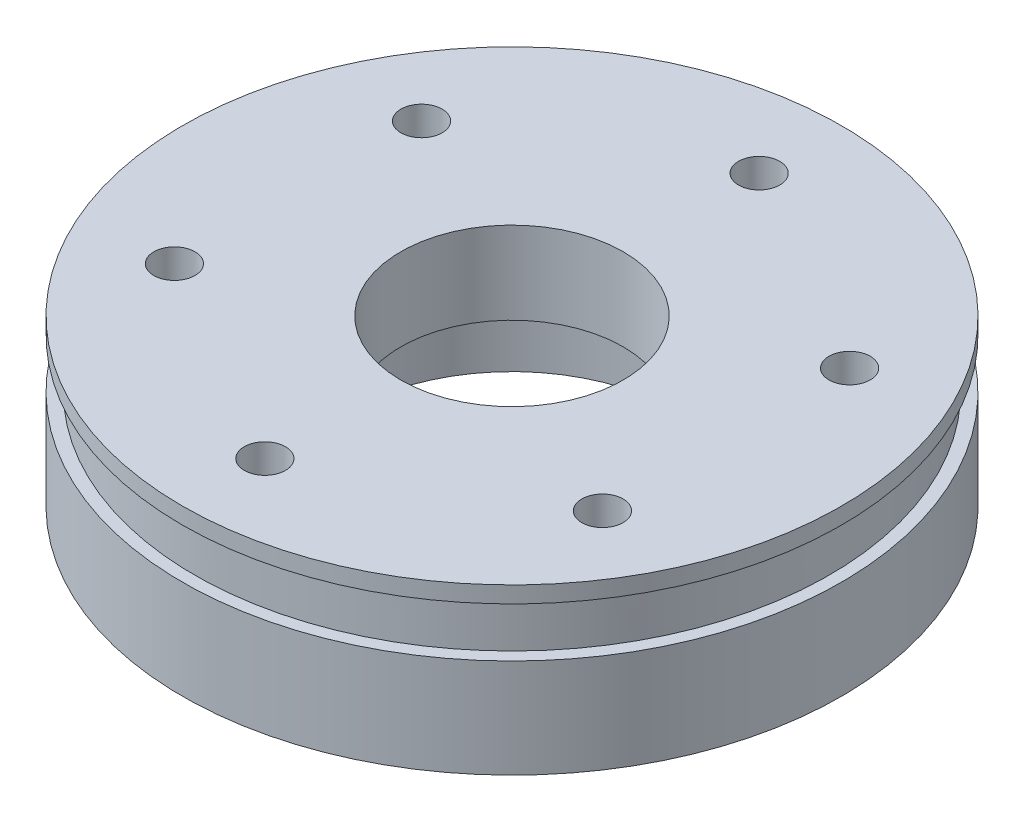
ISO-10303-21;
HEADER;
FILE_DESCRIPTION(('STEP AP214'),'2;1');
FILE_NAME('part.step','',(''),(''),'','','');
FILE_SCHEMA(('AUTOMOTIVE_DESIGN { 1 0 10303 214 1 1 1 1 }'));
ENDSEC;
DATA;
#1=APPLICATION_CONTEXT('core data for automotive mechanical design processes');
#2=APPLICATION_PROTOCOL_DEFINITION('international standard','automotive_design',2000,#1);
#3=PRODUCT_CONTEXT('',#1,'mechanical');
#4=PRODUCT('Part','Part','',(#3));
#5=PRODUCT_RELATED_PRODUCT_CATEGORY('part','',(#4));
#6=PRODUCT_DEFINITION_FORMATION('','',#4);
#7=PRODUCT_DEFINITION_CONTEXT('part definition',#1,'design');
#8=PRODUCT_DEFINITION('design','',#6,#7);
#9=PRODUCT_DEFINITION_SHAPE('','',#8);
#10=(LENGTH_UNIT() NAMED_UNIT(*) SI_UNIT(.MILLI.,.METRE.));
#11=(NAMED_UNIT(*) PLANE_ANGLE_UNIT() SI_UNIT($,.RADIAN.));
#12=(NAMED_UNIT(*) SI_UNIT($,.STERADIAN.) SOLID_ANGLE_UNIT());
#13=UNCERTAINTY_MEASURE_WITH_UNIT(LENGTH_MEASURE(1.E-05),#10,'distance_accuracy_value','');
#14=(GEOMETRIC_REPRESENTATION_CONTEXT(3) GLOBAL_UNCERTAINTY_ASSIGNED_CONTEXT((#13)) GLOBAL_UNIT_ASSIGNED_CONTEXT((#10,
#11,#12)) REPRESENTATION_CONTEXT('',''));
#15=CARTESIAN_POINT('',(0.,0.,0.));
#16=DIRECTION('',(0.,0.,1.));
#17=DIRECTION('',(1.,0.,0.));
#18=AXIS2_PLACEMENT_3D('',#15,#16,#17);
#19=CARTESIAN_POINT('',(0.,10.,0.));
#20=DIRECTION('',(0.,-1.,0.));
#21=DIRECTION('',(0.,0.,-1.));
#22=AXIS2_PLACEMENT_3D('',#19,#20,#21);
#23=CYLINDRICAL_SURFACE('',#22,13.5);
#24=CARTESIAN_POINT('',(0.,10.,0.));
#25=DIRECTION('',(0.,-1.,0.));
#26=DIRECTION('',(0.,0.,-1.));
#27=AXIS2_PLACEMENT_3D('',#24,#25,#26);
#28=CIRCLE('',#27,13.5);
#29=CARTESIAN_POINT('',(0.,10.,-13.5));
#30=VERTEX_POINT('',#29);
#31=EDGE_CURVE('E58',#30,#30,#28,.T.);
#32=ORIENTED_EDGE('',*,*,#31,.F.);
#33=EDGE_LOOP('',(#32));
#34=FACE_BOUND('',#33,.T.);
#35=CARTESIAN_POINT('',(0.,0.,0.));
#36=DIRECTION('',(0.,-1.,0.));
#37=DIRECTION('',(0.,0.,-1.));
#38=AXIS2_PLACEMENT_3D('',#35,#36,#37);
#39=CIRCLE('',#38,13.5);
#40=CARTESIAN_POINT('',(0.,0.,-13.5));
#41=VERTEX_POINT('',#40);
#42=EDGE_CURVE('E36',#41,#41,#39,.F.);
#43=ORIENTED_EDGE('',*,*,#42,.F.);
#44=EDGE_LOOP('',(#43));
#45=FACE_BOUND('',#44,.T.);
#46=ADVANCED_FACE('F32',(#34,#45),#23,.F.);
#47=CARTESIAN_POINT('',(0.,10.,0.));
#48=DIRECTION('',(0.,-1.,0.));
#49=DIRECTION('',(0.,0.,-1.));
#50=AXIS2_PLACEMENT_3D('',#47,#48,#49);
#51=CYLINDRICAL_SURFACE('',#50,38.515);
#52=CARTESIAN_POINT('',(0.,8.,0.));
#53=DIRECTION('',(0.,1.,0.));
#54=DIRECTION('',(0.,0.,1.));
#55=AXIS2_PLACEMENT_3D('',#52,#53,#54);
#56=CIRCLE('',#55,38.515);
#57=CARTESIAN_POINT('',(0.,8.,38.515));
#58=VERTEX_POINT('',#57);
#59=EDGE_CURVE('E40',#58,#58,#56,.T.);
#60=ORIENTED_EDGE('',*,*,#59,.F.);
#61=EDGE_LOOP('',(#60));
#62=FACE_BOUND('',#61,.T.);
#63=CARTESIAN_POINT('',(0.,2.,0.));
#64=DIRECTION('',(0.,-1.,0.));
#65=DIRECTION('',(0.,0.,-1.));
#66=AXIS2_PLACEMENT_3D('',#63,#64,#65);
#67=CIRCLE('',#66,38.515);
#68=CARTESIAN_POINT('',(0.,2.,-38.515));
#69=VERTEX_POINT('',#68);
#70=EDGE_CURVE('E10',#69,#69,#67,.T.);
#71=ORIENTED_EDGE('',*,*,#70,.F.);
#72=EDGE_LOOP('',(#71));
#73=FACE_BOUND('',#72,.T.);
#74=ADVANCED_FACE('F34',(#62,#73),#51,.T.);
#75=CARTESIAN_POINT('',(0.,8.,0.));
#76=DIRECTION('',(0.,1.,0.));
#77=DIRECTION('',(0.,0.,1.));
#78=AXIS2_PLACEMENT_3D('',#75,#76,#77);
#79=CYLINDRICAL_SURFACE('',#78,40.);
#80=CARTESIAN_POINT('',(0.,8.,0.));
#81=DIRECTION('',(0.,1.,0.));
#82=DIRECTION('',(0.,0.,1.));
#83=AXIS2_PLACEMENT_3D('',#80,#81,#82);
#84=CIRCLE('',#83,40.);
#85=CARTESIAN_POINT('',(0.,8.,40.));
#86=VERTEX_POINT('',#85);
#87=EDGE_CURVE('E44',#86,#86,#84,.T.);
#88=ORIENTED_EDGE('',*,*,#87,.T.);
#89=EDGE_LOOP('',(#88));
#90=FACE_BOUND('',#89,.T.);
#91=CARTESIAN_POINT('',(0.,10.,0.));
#92=DIRECTION('',(0.,1.,0.));
#93=DIRECTION('',(0.,0.,1.));
#94=AXIS2_PLACEMENT_3D('',#91,#92,#93);
#95=CIRCLE('',#94,40.);
#96=CARTESIAN_POINT('',(0.,10.,40.));
#97=VERTEX_POINT('',#96);
#98=EDGE_CURVE('E47',#97,#97,#95,.T.);
#99=ORIENTED_EDGE('',*,*,#98,.F.);
#100=EDGE_LOOP('',(#99));
#101=FACE_BOUND('',#100,.T.);
#102=ADVANCED_FACE('F115',(#90,#101),#79,.T.);
#103=CARTESIAN_POINT('',(0.,8.,0.));
#104=DIRECTION('',(0.,1.,0.));
#105=DIRECTION('',(0.,0.,1.));
#106=AXIS2_PLACEMENT_3D('',#103,#104,#105);
#107=PLANE('',#106);
#108=ORIENTED_EDGE('',*,*,#59,.T.);
#109=EDGE_LOOP('',(#108));
#110=FACE_BOUND('',#109,.T.);
#111=ORIENTED_EDGE('',*,*,#87,.F.);
#112=EDGE_LOOP('',(#111));
#113=FACE_BOUND('',#112,.T.);
#114=ADVANCED_FACE('F135',(#110,#113),#107,.F.);
#115=CARTESIAN_POINT('',(0.,10.,0.));
#116=DIRECTION('',(0.,1.,0.));
#117=DIRECTION('',(0.,0.,1.));
#118=AXIS2_PLACEMENT_3D('',#115,#116,#117);
#119=PLANE('',#118);
#120=CARTESIAN_POINT('',(-25.9807621135323,10.,14.9999999999985));
#121=DIRECTION('',(0.,-1.,0.));
#122=DIRECTION('',(0.,0.,-1.));
#123=AXIS2_PLACEMENT_3D('',#120,#121,#122);
#124=CIRCLE('',#123,2.5000000000016);
#125=CARTESIAN_POINT('',(-25.9807621135323,10.,12.4999999999969));
#126=VERTEX_POINT('',#125);
#127=EDGE_CURVE('E65',#126,#126,#124,.T.);
#128=ORIENTED_EDGE('',*,*,#127,.T.);
#129=EDGE_LOOP('',(#128));
#130=FACE_BOUND('',#129,.T.);
#131=CARTESIAN_POINT('',(-25.9807621135306,10.,-15.0000000000015));
#132=DIRECTION('',(0.,-1.,0.));
#133=DIRECTION('',(0.,0.,-1.));
#134=AXIS2_PLACEMENT_3D('',#131,#132,#133);
#135=CIRCLE('',#134,2.50000000000315);
#136=CARTESIAN_POINT('',(-25.9807621135306,10.,-17.5000000000046));
#137=VERTEX_POINT('',#136);
#138=EDGE_CURVE('E71',#137,#137,#135,.T.);
#139=ORIENTED_EDGE('',*,*,#138,.T.);
#140=EDGE_LOOP('',(#139));
#141=FACE_BOUND('',#140,.T.);
#142=CARTESIAN_POINT('',(3.39958331045615E-12,10.,-30.));
#143=DIRECTION('',(0.,-1.,0.));
#144=DIRECTION('',(0.,0.,-1.));
#145=AXIS2_PLACEMENT_3D('',#142,#143,#144);
#146=CIRCLE('',#145,2.50000000000345);
#147=CARTESIAN_POINT('',(3.39958331045615E-12,10.,-32.5000000000035));
#148=VERTEX_POINT('',#147);
#149=EDGE_CURVE('E77',#148,#148,#146,.T.);
#150=ORIENTED_EDGE('',*,*,#149,.T.);
#151=EDGE_LOOP('',(#150));
#152=FACE_BOUND('',#151,.T.);
#153=CARTESIAN_POINT('',(25.9807621135357,10.,-14.9999999999985));
#154=DIRECTION('',(0.,-1.,0.));
#155=DIRECTION('',(0.,0.,-1.));
#156=AXIS2_PLACEMENT_3D('',#153,#154,#155);
#157=CIRCLE('',#156,2.50000000000215);
#158=CARTESIAN_POINT('',(25.9807621135357,10.,-17.5000000000007));
#159=VERTEX_POINT('',#158);
#160=EDGE_CURVE('E83',#159,#159,#157,.T.);
#161=ORIENTED_EDGE('',*,*,#160,.T.);
#162=EDGE_LOOP('',(#161));
#163=FACE_BOUND('',#162,.T.);
#164=CARTESIAN_POINT('',(25.980762113534,10.,15.0000000000015));
#165=DIRECTION('',(0.,-1.,0.));
#166=DIRECTION('',(0.,0.,-1.));
#167=AXIS2_PLACEMENT_3D('',#164,#165,#166);
#168=CIRCLE('',#167,2.50000000000046);
#169=CARTESIAN_POINT('',(25.980762113534,10.,12.500000000001));
#170=VERTEX_POINT('',#169);
#171=EDGE_CURVE('E89',#170,#170,#168,.T.);
#172=ORIENTED_EDGE('',*,*,#171,.T.);
#173=EDGE_LOOP('',(#172));
#174=FACE_BOUND('',#173,.T.);
#175=CARTESIAN_POINT('',(0.,10.,30.));
#176=DIRECTION('',(0.,-1.,0.));
#177=DIRECTION('',(0.,0.,-1.));
#178=AXIS2_PLACEMENT_3D('',#175,#176,#177);
#179=CIRCLE('',#178,2.5);
#180=CARTESIAN_POINT('',(0.,10.,27.5));
#181=VERTEX_POINT('',#180);
#182=EDGE_CURVE('E61',#181,#181,#179,.T.);
#183=ORIENTED_EDGE('',*,*,#182,.T.);
#184=EDGE_LOOP('',(#183));
#185=FACE_BOUND('',#184,.T.);
#186=ORIENTED_EDGE('',*,*,#31,.T.);
#187=EDGE_LOOP('',(#186));
#188=FACE_BOUND('',#187,.T.);
#189=ORIENTED_EDGE('',*,*,#98,.T.);
#190=EDGE_LOOP('',(#189));
#191=FACE_BOUND('',#190,.T.);
#192=ADVANCED_FACE('F133',(#130,#141,#152,#163,#174,#185,#188,#191),#119,.T.);
#193=CARTESIAN_POINT('',(0.,-10.,0.));
#194=DIRECTION('',(0.,1.,0.));
#195=DIRECTION('',(0.,0.,1.));
#196=AXIS2_PLACEMENT_3D('',#193,#194,#195);
#197=CYLINDRICAL_SURFACE('',#196,40.);
#198=CARTESIAN_POINT('',(0.,-10.,0.));
#199=DIRECTION('',(0.,-1.,0.));
#200=DIRECTION('',(0.,0.,-1.));
#201=AXIS2_PLACEMENT_3D('',#198,#199,#200);
#202=CIRCLE('',#201,40.);
#203=CARTESIAN_POINT('',(0.,-10.,-40.));
#204=VERTEX_POINT('',#203);
#205=EDGE_CURVE('E50',#204,#204,#202,.T.);
#206=ORIENTED_EDGE('',*,*,#205,.F.);
#207=EDGE_LOOP('',(#206));
#208=FACE_BOUND('',#207,.T.);
#209=CARTESIAN_POINT('',(0.,2.,0.));
#210=DIRECTION('',(0.,-1.,0.));
#211=DIRECTION('',(0.,0.,-1.));
#212=AXIS2_PLACEMENT_3D('',#209,#210,#211);
#213=CIRCLE('',#212,40.);
#214=CARTESIAN_POINT('',(0.,2.,-40.));
#215=VERTEX_POINT('',#214);
#216=EDGE_CURVE('E55',#215,#215,#213,.T.);
#217=ORIENTED_EDGE('',*,*,#216,.T.);
#218=EDGE_LOOP('',(#217));
#219=FACE_BOUND('',#218,.T.);
#220=ADVANCED_FACE('F129',(#208,#219),#197,.T.);
#221=CARTESIAN_POINT('',(0.,-10.,0.));
#222=DIRECTION('',(0.,-1.,0.));
#223=DIRECTION('',(0.,0.,-1.));
#224=AXIS2_PLACEMENT_3D('',#221,#222,#223);
#225=PLANE('',#224);
#226=CARTESIAN_POINT('',(0.,-10.,0.));
#227=DIRECTION('',(0.,-1.,0.));
#228=DIRECTION('',(0.,0.,-1.));
#229=AXIS2_PLACEMENT_3D('',#226,#227,#228);
#230=CIRCLE('',#229,20.);
#231=CARTESIAN_POINT('',(0.,-10.,-20.));
#232=VERTEX_POINT('',#231);
#233=EDGE_CURVE('E97',#232,#232,#230,.T.);
#234=ORIENTED_EDGE('',*,*,#233,.F.);
#235=EDGE_LOOP('',(#234));
#236=FACE_BOUND('',#235,.T.);
#237=CARTESIAN_POINT('',(-25.9807621135323,-10.,14.9999999999985));
#238=DIRECTION('',(0.,-1.,0.));
#239=DIRECTION('',(0.,0.,-1.));
#240=AXIS2_PLACEMENT_3D('',#237,#238,#239);
#241=CIRCLE('',#240,2.5000000000016);
#242=CARTESIAN_POINT('',(-25.9807621135323,-10.,12.4999999999969));
#243=VERTEX_POINT('',#242);
#244=EDGE_CURVE('E62',#243,#243,#241,.T.);
#245=ORIENTED_EDGE('',*,*,#244,.F.);
#246=EDGE_LOOP('',(#245));
#247=FACE_BOUND('',#246,.T.);
#248=CARTESIAN_POINT('',(-25.9807621135306,-10.,-15.0000000000015));
#249=DIRECTION('',(0.,-1.,0.));
#250=DIRECTION('',(0.,0.,-1.));
#251=AXIS2_PLACEMENT_3D('',#248,#249,#250);
#252=CIRCLE('',#251,2.50000000000315);
#253=CARTESIAN_POINT('',(-25.9807621135306,-10.,-17.5000000000046));
#254=VERTEX_POINT('',#253);
#255=EDGE_CURVE('E68',#254,#254,#252,.T.);
#256=ORIENTED_EDGE('',*,*,#255,.F.);
#257=EDGE_LOOP('',(#256));
#258=FACE_BOUND('',#257,.T.);
#259=CARTESIAN_POINT('',(3.39958331045615E-12,-10.,-30.));
#260=DIRECTION('',(0.,-1.,0.));
#261=DIRECTION('',(0.,0.,-1.));
#262=AXIS2_PLACEMENT_3D('',#259,#260,#261);
#263=CIRCLE('',#262,2.50000000000345);
#264=CARTESIAN_POINT('',(3.39958331045615E-12,-10.,-32.5000000000035));
#265=VERTEX_POINT('',#264);
#266=EDGE_CURVE('E74',#265,#265,#263,.T.);
#267=ORIENTED_EDGE('',*,*,#266,.F.);
#268=EDGE_LOOP('',(#267));
#269=FACE_BOUND('',#268,.T.);
#270=CARTESIAN_POINT('',(25.9807621135357,-10.,-14.9999999999985));
#271=DIRECTION('',(0.,-1.,0.));
#272=DIRECTION('',(0.,0.,-1.));
#273=AXIS2_PLACEMENT_3D('',#270,#271,#272);
#274=CIRCLE('',#273,2.50000000000215);
#275=CARTESIAN_POINT('',(25.9807621135357,-10.,-17.5000000000007));
#276=VERTEX_POINT('',#275);
#277=EDGE_CURVE('E80',#276,#276,#274,.T.);
#278=ORIENTED_EDGE('',*,*,#277,.F.);
#279=EDGE_LOOP('',(#278));
#280=FACE_BOUND('',#279,.T.);
#281=CARTESIAN_POINT('',(25.980762113534,-10.,15.0000000000015));
#282=DIRECTION('',(0.,-1.,0.));
#283=DIRECTION('',(0.,0.,-1.));
#284=AXIS2_PLACEMENT_3D('',#281,#282,#283);
#285=CIRCLE('',#284,2.50000000000046);
#286=CARTESIAN_POINT('',(25.980762113534,-10.,12.500000000001));
#287=VERTEX_POINT('',#286);
#288=EDGE_CURVE('E86',#287,#287,#285,.T.);
#289=ORIENTED_EDGE('',*,*,#288,.F.);
#290=EDGE_LOOP('',(#289));
#291=FACE_BOUND('',#290,.T.);
#292=CARTESIAN_POINT('',(0.,-10.,30.));
#293=DIRECTION('',(0.,-1.,0.));
#294=DIRECTION('',(0.,0.,-1.));
#295=AXIS2_PLACEMENT_3D('',#292,#293,#294);
#296=CIRCLE('',#295,2.5);
#297=CARTESIAN_POINT('',(0.,-10.,27.5));
#298=VERTEX_POINT('',#297);
#299=EDGE_CURVE('E92',#298,#298,#296,.T.);
#300=ORIENTED_EDGE('',*,*,#299,.F.);
#301=EDGE_LOOP('',(#300));
#302=FACE_BOUND('',#301,.T.);
#303=ORIENTED_EDGE('',*,*,#205,.T.);
#304=EDGE_LOOP('',(#303));
#305=FACE_BOUND('',#304,.T.);
#306=ADVANCED_FACE('F126',(#236,#247,#258,#269,#280,#291,#302,#305),#225,.T.);
#307=CARTESIAN_POINT('',(0.,2.,0.));
#308=DIRECTION('',(0.,-1.,0.));
#309=DIRECTION('',(0.,0.,-1.));
#310=AXIS2_PLACEMENT_3D('',#307,#308,#309);
#311=PLANE('',#310);
#312=ORIENTED_EDGE('',*,*,#70,.T.);
#313=EDGE_LOOP('',(#312));
#314=FACE_BOUND('',#313,.T.);
#315=ORIENTED_EDGE('',*,*,#216,.F.);
#316=EDGE_LOOP('',(#315));
#317=FACE_BOUND('',#316,.T.);
#318=ADVANCED_FACE('F122',(#314,#317),#311,.F.);
#319=CARTESIAN_POINT('',(0.,10.,30.));
#320=DIRECTION('',(0.,-1.,0.));
#321=DIRECTION('',(0.,0.,-1.));
#322=AXIS2_PLACEMENT_3D('',#319,#320,#321);
#323=CYLINDRICAL_SURFACE('',#322,2.5);
#324=ORIENTED_EDGE('',*,*,#182,.F.);
#325=EDGE_LOOP('',(#324));
#326=FACE_BOUND('',#325,.T.);
#327=ORIENTED_EDGE('',*,*,#299,.T.);
#328=EDGE_LOOP('',(#327));
#329=FACE_BOUND('',#328,.T.);
#330=ADVANCED_FACE('F125',(#326,#329),#323,.F.);
#331=CARTESIAN_POINT('',(25.980762113534,10.,15.0000000000015));
#332=DIRECTION('',(0.,-1.,0.));
#333=DIRECTION('',(0.,0.,-1.));
#334=AXIS2_PLACEMENT_3D('',#331,#332,#333);
#335=CYLINDRICAL_SURFACE('',#334,2.50000000000046);
#336=ORIENTED_EDGE('',*,*,#171,.F.);
#337=EDGE_LOOP('',(#336));
#338=FACE_BOUND('',#337,.T.);
#339=ORIENTED_EDGE('',*,*,#288,.T.);
#340=EDGE_LOOP('',(#339));
#341=FACE_BOUND('',#340,.T.);
#342=ADVANCED_FACE('F163',(#338,#341),#335,.F.);
#343=CARTESIAN_POINT('',(25.9807621135357,10.,-14.9999999999985));
#344=DIRECTION('',(0.,-1.,0.));
#345=DIRECTION('',(0.,0.,-1.));
#346=AXIS2_PLACEMENT_3D('',#343,#344,#345);
#347=CYLINDRICAL_SURFACE('',#346,2.50000000000215);
#348=ORIENTED_EDGE('',*,*,#160,.F.);
#349=EDGE_LOOP('',(#348));
#350=FACE_BOUND('',#349,.T.);
#351=ORIENTED_EDGE('',*,*,#277,.T.);
#352=EDGE_LOOP('',(#351));
#353=FACE_BOUND('',#352,.T.);
#354=ADVANCED_FACE('F175',(#350,#353),#347,.F.);
#355=CARTESIAN_POINT('',(3.39958331045615E-12,10.,-30.));
#356=DIRECTION('',(0.,-1.,0.));
#357=DIRECTION('',(0.,0.,-1.));
#358=AXIS2_PLACEMENT_3D('',#355,#356,#357);
#359=CYLINDRICAL_SURFACE('',#358,2.50000000000345);
#360=ORIENTED_EDGE('',*,*,#149,.F.);
#361=EDGE_LOOP('',(#360));
#362=FACE_BOUND('',#361,.T.);
#363=ORIENTED_EDGE('',*,*,#266,.T.);
#364=EDGE_LOOP('',(#363));
#365=FACE_BOUND('',#364,.T.);
#366=ADVANCED_FACE('F184',(#362,#365),#359,.F.);
#367=CARTESIAN_POINT('',(-25.9807621135306,10.,-15.0000000000015));
#368=DIRECTION('',(0.,-1.,0.));
#369=DIRECTION('',(0.,0.,-1.));
#370=AXIS2_PLACEMENT_3D('',#367,#368,#369);
#371=CYLINDRICAL_SURFACE('',#370,2.50000000000315);
#372=ORIENTED_EDGE('',*,*,#138,.F.);
#373=EDGE_LOOP('',(#372));
#374=FACE_BOUND('',#373,.T.);
#375=ORIENTED_EDGE('',*,*,#255,.T.);
#376=EDGE_LOOP('',(#375));
#377=FACE_BOUND('',#376,.T.);
#378=ADVANCED_FACE('F187',(#374,#377),#371,.F.);
#379=CARTESIAN_POINT('',(-25.9807621135323,10.,14.9999999999985));
#380=DIRECTION('',(0.,-1.,0.));
#381=DIRECTION('',(0.,0.,-1.));
#382=AXIS2_PLACEMENT_3D('',#379,#380,#381);
#383=CYLINDRICAL_SURFACE('',#382,2.5000000000016);
#384=ORIENTED_EDGE('',*,*,#127,.F.);
#385=EDGE_LOOP('',(#384));
#386=FACE_BOUND('',#385,.T.);
#387=ORIENTED_EDGE('',*,*,#244,.T.);
#388=EDGE_LOOP('',(#387));
#389=FACE_BOUND('',#388,.T.);
#390=ADVANCED_FACE('F120',(#386,#389),#383,.F.);
#391=CARTESIAN_POINT('',(0.,0.,0.));
#392=DIRECTION('',(0.,-1.,0.));
#393=DIRECTION('',(0.,0.,-1.));
#394=AXIS2_PLACEMENT_3D('',#391,#392,#393);
#395=PLANE('',#394);
#396=CARTESIAN_POINT('',(0.,0.,0.));
#397=DIRECTION('',(0.,-1.,0.));
#398=DIRECTION('',(0.,0.,-1.));
#399=AXIS2_PLACEMENT_3D('',#396,#397,#398);
#400=CIRCLE('',#399,20.);
#401=CARTESIAN_POINT('',(0.,0.,-20.));
#402=VERTEX_POINT('',#401);
#403=EDGE_CURVE('E100',#402,#402,#400,.T.);
#404=ORIENTED_EDGE('',*,*,#403,.T.);
#405=EDGE_LOOP('',(#404));
#406=FACE_BOUND('',#405,.T.);
#407=ORIENTED_EDGE('',*,*,#42,.T.);
#408=EDGE_LOOP('',(#407));
#409=FACE_BOUND('',#408,.T.);
#410=ADVANCED_FACE('F107',(#406,#409),#395,.T.);
#411=CARTESIAN_POINT('',(0.,0.,0.));
#412=DIRECTION('',(0.,-1.,0.));
#413=DIRECTION('',(0.,0.,-1.));
#414=AXIS2_PLACEMENT_3D('',#411,#412,#413);
#415=CYLINDRICAL_SURFACE('',#414,20.);
#416=ORIENTED_EDGE('',*,*,#403,.F.);
#417=EDGE_LOOP('',(#416));
#418=FACE_BOUND('',#417,.T.);
#419=ORIENTED_EDGE('',*,*,#233,.T.);
#420=EDGE_LOOP('',(#419));
#421=FACE_BOUND('',#420,.T.);
#422=ADVANCED_FACE('F179',(#418,#421),#415,.F.);
#423=CLOSED_SHELL('',(#46,#74,#102,#114,#192,#220,#306,#318,#330,#342,#354,#366,#378,#390,#410,#422));
#424=MANIFOLD_SOLID_BREP('B2',#423);
#425=ADVANCED_BREP_SHAPE_REPRESENTATION('',(#18,#424),#14);
#426=SHAPE_DEFINITION_REPRESENTATION(#9,#425);
ENDSEC;
END-ISO-10303-21;
